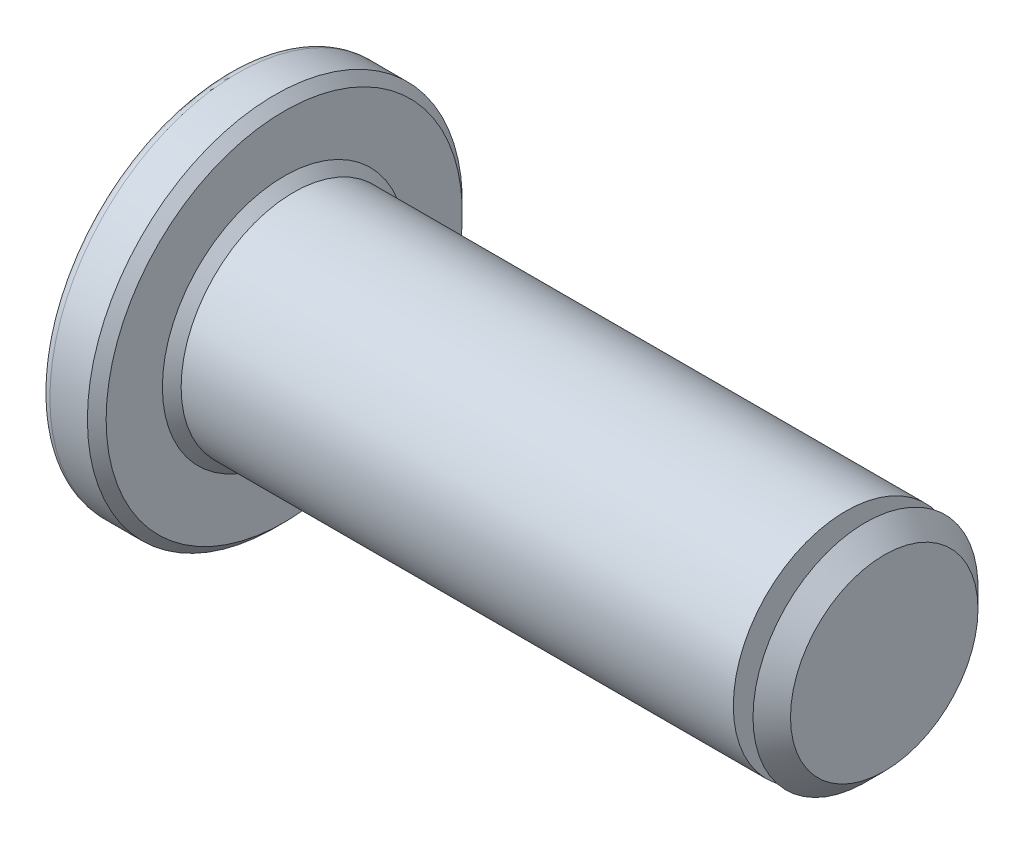
ISO-10303-21;
HEADER;
FILE_DESCRIPTION(('STEP AP214'),'2;1');
FILE_NAME('part.step','',(''),(''),'','','');
FILE_SCHEMA(('AUTOMOTIVE_DESIGN { 1 0 10303 214 1 1 1 1 }'));
ENDSEC;
DATA;
#1=APPLICATION_CONTEXT('core data for automotive mechanical design processes');
#2=APPLICATION_PROTOCOL_DEFINITION('international standard','automotive_design',2000,#1);
#3=PRODUCT_CONTEXT('',#1,'mechanical');
#4=PRODUCT('Part','Part','',(#3));
#5=PRODUCT_RELATED_PRODUCT_CATEGORY('part','',(#4));
#6=PRODUCT_DEFINITION_FORMATION('','',#4);
#7=PRODUCT_DEFINITION_CONTEXT('part definition',#1,'design');
#8=PRODUCT_DEFINITION('design','',#6,#7);
#9=PRODUCT_DEFINITION_SHAPE('','',#8);
#10=(LENGTH_UNIT() NAMED_UNIT(*) SI_UNIT(.MILLI.,.METRE.));
#11=(NAMED_UNIT(*) PLANE_ANGLE_UNIT() SI_UNIT($,.RADIAN.));
#12=(NAMED_UNIT(*) SI_UNIT($,.STERADIAN.) SOLID_ANGLE_UNIT());
#13=UNCERTAINTY_MEASURE_WITH_UNIT(LENGTH_MEASURE(1.E-05),#10,'distance_accuracy_value','');
#14=(GEOMETRIC_REPRESENTATION_CONTEXT(3) GLOBAL_UNCERTAINTY_ASSIGNED_CONTEXT((#13)) GLOBAL_UNIT_ASSIGNED_CONTEXT((#10,
#11,#12)) REPRESENTATION_CONTEXT('',''));
#15=CARTESIAN_POINT('',(0.,0.,0.));
#16=DIRECTION('',(0.,0.,1.));
#17=DIRECTION('',(1.,0.,0.));
#18=AXIS2_PLACEMENT_3D('',#15,#16,#17);
#19=CARTESIAN_POINT('',(0.,0.,0.));
#20=DIRECTION('',(1.,0.,0.));
#21=DIRECTION('',(0.,0.,-1.));
#22=AXIS2_PLACEMENT_3D('',#19,#20,#21);
#23=PLANE('',#22);
#24=CARTESIAN_POINT('',(0.,0.,0.));
#25=DIRECTION('',(1.,0.,0.));
#26=DIRECTION('',(0.,0.,-1.));
#27=AXIS2_PLACEMENT_3D('',#24,#25,#26);
#28=CIRCLE('',#27,9.5);
#29=CARTESIAN_POINT('',(0.,0.,-9.5));
#30=VERTEX_POINT('',#29);
#31=EDGE_CURVE('E46',#30,#30,#28,.F.);
#32=ORIENTED_EDGE('',*,*,#31,.T.);
#33=EDGE_LOOP('',(#32));
#34=FACE_BOUND('',#33,.T.);
#35=ADVANCED_FACE('F38',(#34),#23,.F.);
#36=CARTESIAN_POINT('',(-16.3260779863833,0.,0.));
#37=DIRECTION('',(-1.,0.,0.));
#38=DIRECTION('',(0.,0.,1.));
#39=AXIS2_PLACEMENT_3D('',#36,#37,#38);
#40=CYLINDRICAL_SURFACE('',#39,10.);
#41=CARTESIAN_POINT('',(0.5,0.,0.));
#42=DIRECTION('',(1.,0.,0.));
#43=DIRECTION('',(0.,0.,-1.));
#44=AXIS2_PLACEMENT_3D('',#41,#42,#43);
#45=CIRCLE('',#44,10.);
#46=CARTESIAN_POINT('',(0.5,0.,-10.));
#47=VERTEX_POINT('',#46);
#48=EDGE_CURVE('E10',#47,#47,#45,.T.);
#49=ORIENTED_EDGE('',*,*,#48,.T.);
#50=EDGE_LOOP('',(#49));
#51=FACE_BOUND('',#50,.T.);
#52=CARTESIAN_POINT('',(2.49999999999999,0.,0.));
#53=DIRECTION('',(-1.,0.,0.));
#54=DIRECTION('',(0.,0.,1.));
#55=AXIS2_PLACEMENT_3D('',#52,#53,#54);
#56=CIRCLE('',#55,10.);
#57=CARTESIAN_POINT('',(2.49999999999999,0.,10.));
#58=VERTEX_POINT('',#57);
#59=EDGE_CURVE('E70',#58,#58,#56,.T.);
#60=ORIENTED_EDGE('',*,*,#59,.T.);
#61=EDGE_LOOP('',(#60));
#62=FACE_BOUND('',#61,.T.);
#63=ADVANCED_FACE('F108',(#51,#62),#40,.T.);
#64=CARTESIAN_POINT('',(3.,10.,0.));
#65=DIRECTION('',(-1.,0.,0.));
#66=DIRECTION('',(0.,0.,1.));
#67=AXIS2_PLACEMENT_3D('',#64,#65,#66);
#68=PLANE('',#67);
#69=CARTESIAN_POINT('',(3.,0.,0.));
#70=DIRECTION('',(-1.,0.,0.));
#71=DIRECTION('',(0.,0.,1.));
#72=AXIS2_PLACEMENT_3D('',#69,#70,#71);
#73=CIRCLE('',#72,6.49999999999999);
#74=CARTESIAN_POINT('',(3.,0.,6.49999999999999));
#75=VERTEX_POINT('',#74);
#76=EDGE_CURVE('E62',#75,#75,#73,.T.);
#77=ORIENTED_EDGE('',*,*,#76,.T.);
#78=EDGE_LOOP('',(#77));
#79=FACE_BOUND('',#78,.T.);
#80=CARTESIAN_POINT('',(3.,0.,0.));
#81=DIRECTION('',(-1.,0.,0.));
#82=DIRECTION('',(0.,0.,1.));
#83=AXIS2_PLACEMENT_3D('',#80,#81,#82);
#84=CIRCLE('',#83,9.49999999999999);
#85=CARTESIAN_POINT('',(3.,0.,9.49999999999999));
#86=VERTEX_POINT('',#85);
#87=EDGE_CURVE('E66',#86,#86,#84,.F.);
#88=ORIENTED_EDGE('',*,*,#87,.T.);
#89=EDGE_LOOP('',(#88));
#90=FACE_BOUND('',#89,.T.);
#91=ADVANCED_FACE('F113',(#79,#90),#68,.F.);
#92=CARTESIAN_POINT('',(-16.3260779863833,0.,0.));
#93=DIRECTION('',(-1.,0.,0.));
#94=DIRECTION('',(0.,0.,1.));
#95=AXIS2_PLACEMENT_3D('',#92,#93,#94);
#96=CYLINDRICAL_SURFACE('',#95,6.);
#97=CARTESIAN_POINT('',(3.49999999999999,0.,0.));
#98=DIRECTION('',(-1.,0.,0.));
#99=DIRECTION('',(0.,0.,1.));
#100=AXIS2_PLACEMENT_3D('',#97,#98,#99);
#101=CIRCLE('',#100,6.);
#102=CARTESIAN_POINT('',(3.49999999999999,0.,6.));
#103=VERTEX_POINT('',#102);
#104=EDGE_CURVE('E56',#103,#103,#101,.F.);
#105=ORIENTED_EDGE('',*,*,#104,.T.);
#106=EDGE_LOOP('',(#105));
#107=FACE_BOUND('',#106,.T.);
#108=CARTESIAN_POINT('',(32.95,0.,0.));
#109=DIRECTION('',(-1.,0.,0.));
#110=DIRECTION('',(0.,0.,1.));
#111=AXIS2_PLACEMENT_3D('',#108,#109,#110);
#112=CIRCLE('',#111,6.);
#113=CARTESIAN_POINT('',(32.95,0.,6.));
#114=VERTEX_POINT('',#113);
#115=EDGE_CURVE('E74',#114,#114,#112,.T.);
#116=ORIENTED_EDGE('',*,*,#115,.T.);
#117=EDGE_LOOP('',(#116));
#118=FACE_BOUND('',#117,.T.);
#119=ADVANCED_FACE('F139',(#107,#118),#96,.T.);
#120=CARTESIAN_POINT('',(32.95,6.,0.));
#121=DIRECTION('',(-1.,0.,0.));
#122=DIRECTION('',(0.,0.,1.));
#123=AXIS2_PLACEMENT_3D('',#120,#121,#122);
#124=PLANE('',#123);
#125=ORIENTED_EDGE('',*,*,#115,.F.);
#126=EDGE_LOOP('',(#125));
#127=FACE_BOUND('',#126,.T.);
#128=CARTESIAN_POINT('',(32.95,0.,0.));
#129=DIRECTION('',(-1.,0.,0.));
#130=DIRECTION('',(0.,0.,1.));
#131=AXIS2_PLACEMENT_3D('',#128,#129,#130);
#132=CIRCLE('',#131,4.);
#133=CARTESIAN_POINT('',(32.95,0.,4.));
#134=VERTEX_POINT('',#133);
#135=EDGE_CURVE('E78',#134,#134,#132,.T.);
#136=ORIENTED_EDGE('',*,*,#135,.T.);
#137=EDGE_LOOP('',(#136));
#138=FACE_BOUND('',#137,.T.);
#139=ADVANCED_FACE('F144',(#127,#138),#124,.F.);
#140=CARTESIAN_POINT('',(-16.3260779863833,0.,0.));
#141=DIRECTION('',(-1.,0.,0.));
#142=DIRECTION('',(0.,0.,1.));
#143=AXIS2_PLACEMENT_3D('',#140,#141,#142);
#144=CYLINDRICAL_SURFACE('',#143,4.);
#145=ORIENTED_EDGE('',*,*,#135,.F.);
#146=EDGE_LOOP('',(#145));
#147=FACE_BOUND('',#146,.T.);
#148=CARTESIAN_POINT('',(34.,0.,0.));
#149=DIRECTION('',(-1.,0.,0.));
#150=DIRECTION('',(0.,0.,1.));
#151=AXIS2_PLACEMENT_3D('',#148,#149,#150);
#152=CIRCLE('',#151,4.);
#153=CARTESIAN_POINT('',(34.,0.,4.));
#154=VERTEX_POINT('',#153);
#155=EDGE_CURVE('E82',#154,#154,#152,.T.);
#156=ORIENTED_EDGE('',*,*,#155,.T.);
#157=EDGE_LOOP('',(#156));
#158=FACE_BOUND('',#157,.T.);
#159=ADVANCED_FACE('F150',(#147,#158),#144,.T.);
#160=CARTESIAN_POINT('',(34.,4.,0.));
#161=DIRECTION('',(1.,0.,0.));
#162=DIRECTION('',(0.,0.,-1.));
#163=AXIS2_PLACEMENT_3D('',#160,#161,#162);
#164=PLANE('',#163);
#165=ORIENTED_EDGE('',*,*,#155,.F.);
#166=EDGE_LOOP('',(#165));
#167=FACE_BOUND('',#166,.T.);
#168=CARTESIAN_POINT('',(34.,0.,0.));
#169=DIRECTION('',(-1.,0.,0.));
#170=DIRECTION('',(0.,0.,1.));
#171=AXIS2_PLACEMENT_3D('',#168,#169,#170);
#172=CIRCLE('',#171,6.);
#173=CARTESIAN_POINT('',(34.,0.,6.));
#174=VERTEX_POINT('',#173);
#175=EDGE_CURVE('E86',#174,#174,#172,.T.);
#176=ORIENTED_EDGE('',*,*,#175,.T.);
#177=EDGE_LOOP('',(#176));
#178=FACE_BOUND('',#177,.T.);
#179=ADVANCED_FACE('F91',(#167,#178),#164,.F.);
#180=CARTESIAN_POINT('',(35.,6.,0.));
#181=DIRECTION('',(-1.,0.,0.));
#182=DIRECTION('',(0.,0.,1.));
#183=AXIS2_PLACEMENT_3D('',#180,#181,#182);
#184=PLANE('',#183);
#185=CARTESIAN_POINT('',(35.,0.,0.));
#186=DIRECTION('',(-1.,0.,0.));
#187=DIRECTION('',(0.,0.,1.));
#188=AXIS2_PLACEMENT_3D('',#185,#186,#187);
#189=CIRCLE('',#188,4.99999999999999);
#190=CARTESIAN_POINT('',(35.,0.,4.99999999999999));
#191=VERTEX_POINT('',#190);
#192=EDGE_CURVE('E51',#191,#191,#189,.F.);
#193=ORIENTED_EDGE('',*,*,#192,.T.);
#194=EDGE_LOOP('',(#193));
#195=FACE_BOUND('',#194,.T.);
#196=ADVANCED_FACE('F122',(#195),#184,.F.);
#197=CARTESIAN_POINT('',(2.49999999999999,0.,0.));
#198=DIRECTION('',(-1.,0.,0.));
#199=DIRECTION('',(0.,0.,1.));
#200=AXIS2_PLACEMENT_3D('',#197,#198,#199);
#201=CONICAL_SURFACE('',#200,10.,0.78539816339745);
#202=ORIENTED_EDGE('',*,*,#87,.F.);
#203=EDGE_LOOP('',(#202));
#204=FACE_BOUND('',#203,.T.);
#205=ORIENTED_EDGE('',*,*,#59,.F.);
#206=EDGE_LOOP('',(#205));
#207=FACE_BOUND('',#206,.T.);
#208=ADVANCED_FACE('F102',(#204,#207),#201,.T.);
#209=CARTESIAN_POINT('',(3.,0.,0.));
#210=DIRECTION('',(-1.,0.,0.));
#211=DIRECTION('',(0.,0.,1.));
#212=AXIS2_PLACEMENT_3D('',#209,#210,#211);
#213=CONICAL_SURFACE('',#212,6.5,0.78539816339745);
#214=ORIENTED_EDGE('',*,*,#104,.F.);
#215=EDGE_LOOP('',(#214));
#216=FACE_BOUND('',#215,.T.);
#217=ORIENTED_EDGE('',*,*,#76,.F.);
#218=EDGE_LOOP('',(#217));
#219=FACE_BOUND('',#218,.T.);
#220=ADVANCED_FACE('F95',(#216,#219),#213,.T.);
#221=CARTESIAN_POINT('',(34.,0.,0.));
#222=DIRECTION('',(-1.,0.,0.));
#223=DIRECTION('',(0.,0.,1.));
#224=AXIS2_PLACEMENT_3D('',#221,#222,#223);
#225=CONICAL_SURFACE('',#224,6.,0.785398163397454);
#226=ORIENTED_EDGE('',*,*,#192,.F.);
#227=EDGE_LOOP('',(#226));
#228=FACE_BOUND('',#227,.T.);
#229=ORIENTED_EDGE('',*,*,#175,.F.);
#230=EDGE_LOOP('',(#229));
#231=FACE_BOUND('',#230,.T.);
#232=ADVANCED_FACE('F93',(#228,#231),#225,.T.);
#233=CARTESIAN_POINT('',(0.5,0.,0.));
#234=DIRECTION('',(1.,0.,0.));
#235=DIRECTION('',(0.,0.,-1.));
#236=AXIS2_PLACEMENT_3D('',#233,#234,#235);
#237=TOROIDAL_SURFACE('',#236,9.5,0.5);
#238=ORIENTED_EDGE('',*,*,#48,.F.);
#239=EDGE_LOOP('',(#238));
#240=FACE_BOUND('',#239,.T.);
#241=ORIENTED_EDGE('',*,*,#31,.F.);
#242=EDGE_LOOP('',(#241));
#243=FACE_BOUND('',#242,.T.);
#244=ADVANCED_FACE('F40',(#240,#243),#237,.T.);
#245=CLOSED_SHELL('',(#35,#63,#91,#119,#139,#159,#179,#196,#208,#220,#232,#244));
#246=MANIFOLD_SOLID_BREP('B2',#245);
#247=ADVANCED_BREP_SHAPE_REPRESENTATION('',(#18,#246),#14);
#248=SHAPE_DEFINITION_REPRESENTATION(#9,#247);
ENDSEC;
END-ISO-10303-21;
